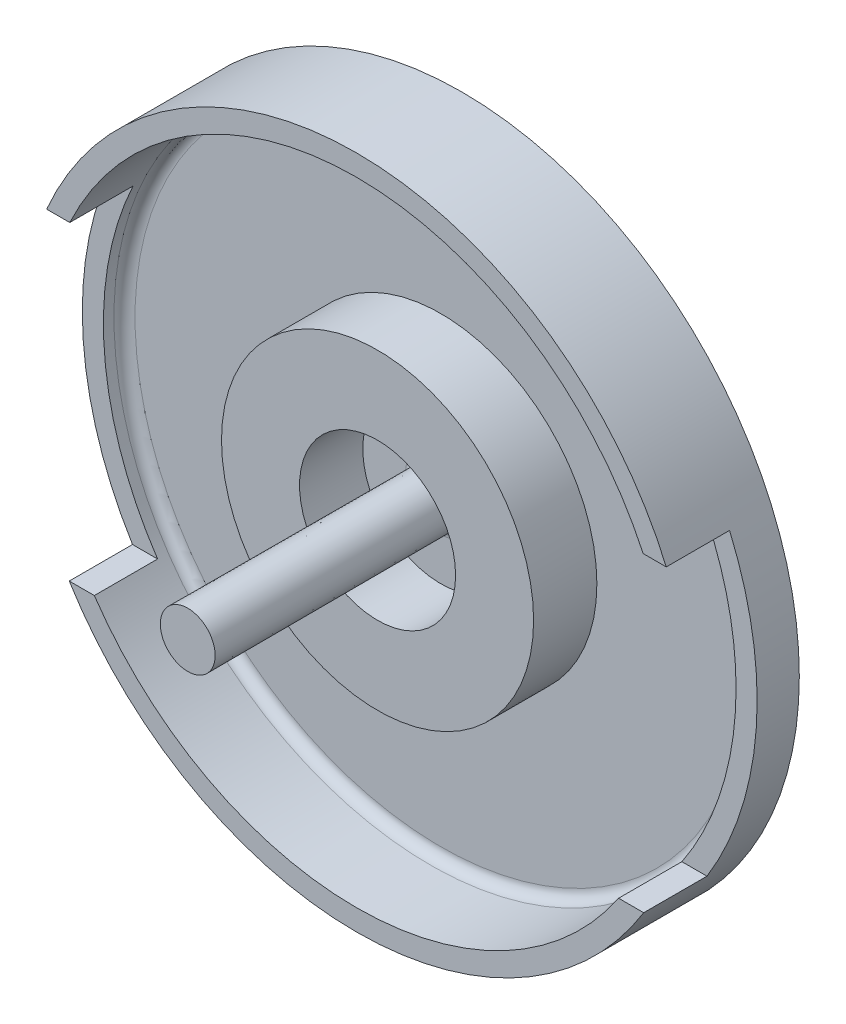
ISO-10303-21;
HEADER;
FILE_DESCRIPTION(('STEP AP214'),'2;1');
FILE_NAME('part.step','',(''),(''),'','','');
FILE_SCHEMA(('AUTOMOTIVE_DESIGN { 1 0 10303 214 1 1 1 1 }'));
ENDSEC;
DATA;
#1=APPLICATION_CONTEXT('core data for automotive mechanical design processes');
#2=APPLICATION_PROTOCOL_DEFINITION('international standard','automotive_design',2000,#1);
#3=PRODUCT_CONTEXT('',#1,'mechanical');
#4=PRODUCT('Part','Part','',(#3));
#5=PRODUCT_RELATED_PRODUCT_CATEGORY('part','',(#4));
#6=PRODUCT_DEFINITION_FORMATION('','',#4);
#7=PRODUCT_DEFINITION_CONTEXT('part definition',#1,'design');
#8=PRODUCT_DEFINITION('design','',#6,#7);
#9=PRODUCT_DEFINITION_SHAPE('','',#8);
#10=(LENGTH_UNIT() NAMED_UNIT(*) SI_UNIT(.MILLI.,.METRE.));
#11=(NAMED_UNIT(*) PLANE_ANGLE_UNIT() SI_UNIT($,.RADIAN.));
#12=(NAMED_UNIT(*) SI_UNIT($,.STERADIAN.) SOLID_ANGLE_UNIT());
#13=UNCERTAINTY_MEASURE_WITH_UNIT(LENGTH_MEASURE(1.E-05),#10,'distance_accuracy_value','');
#14=(GEOMETRIC_REPRESENTATION_CONTEXT(3) GLOBAL_UNCERTAINTY_ASSIGNED_CONTEXT((#13)) GLOBAL_UNIT_ASSIGNED_CONTEXT((#10,
#11,#12)) REPRESENTATION_CONTEXT('',''));
#15=CARTESIAN_POINT('',(0.,0.,0.));
#16=DIRECTION('',(0.,0.,1.));
#17=DIRECTION('',(1.,0.,0.));
#18=AXIS2_PLACEMENT_3D('',#15,#16,#17);
#19=CARTESIAN_POINT('',(0.,0.,1.));
#20=DIRECTION('',(0.,0.,1.));
#21=DIRECTION('',(1.,0.,0.));
#22=AXIS2_PLACEMENT_3D('',#19,#20,#21);
#23=PLANE('',#22);
#24=CARTESIAN_POINT('',(0.,0.,1.));
#25=DIRECTION('',(0.,0.,1.));
#26=DIRECTION('',(1.,0.,0.));
#27=AXIS2_PLACEMENT_3D('',#24,#25,#26);
#28=CIRCLE('',#27,1.67583420138795);
#29=CARTESIAN_POINT('',(1.67583420138795,0.,1.));
#30=VERTEX_POINT('',#29);
#31=EDGE_CURVE('E12',#30,#30,#28,.F.);
#32=ORIENTED_EDGE('',*,*,#31,.T.);
#33=EDGE_LOOP('',(#32));
#34=FACE_BOUND('',#33,.T.);
#35=CARTESIAN_POINT('',(0.,0.,1.));
#36=DIRECTION('',(0.,0.,1.));
#37=DIRECTION('',(1.,0.,0.));
#38=AXIS2_PLACEMENT_3D('',#35,#36,#37);
#39=CIRCLE('',#38,3.7);
#40=CARTESIAN_POINT('',(3.7,0.,1.));
#41=VERTEX_POINT('',#40);
#42=EDGE_CURVE('E393',#41,#41,#39,.T.);
#43=ORIENTED_EDGE('',*,*,#42,.T.);
#44=EDGE_LOOP('',(#43));
#45=FACE_BOUND('',#44,.T.);
#46=ADVANCED_FACE('F43',(#34,#45),#23,.T.);
#47=CARTESIAN_POINT('',(0.,0.,5.));
#48=DIRECTION('',(0.,0.,1.));
#49=DIRECTION('',(1.,0.,0.));
#50=AXIS2_PLACEMENT_3D('',#47,#48,#49);
#51=PLANE('',#50);
#52=CARTESIAN_POINT('',(0.,0.,5.));
#53=DIRECTION('',(0.,0.,1.));
#54=DIRECTION('',(1.,0.,0.));
#55=AXIS2_PLACEMENT_3D('',#52,#53,#54);
#56=CIRCLE('',#55,16.);
#57=CARTESIAN_POINT('',(-13.6201960323075,-8.39584778575195,5.));
#58=VERTEX_POINT('',#57);
#59=CARTESIAN_POINT('',(13.6201960323075,-8.39584778575195,5.));
#60=VERTEX_POINT('',#59);
#61=EDGE_CURVE('E160',#58,#60,#56,.T.);
#62=ORIENTED_EDGE('',*,*,#61,.T.);
#63=DIRECTION('',(-1.,0.,0.));
#64=VECTOR('',#63,1.);
#65=CARTESIAN_POINT('',(0.,-8.39584778575195,5.));
#66=LINE('',#65,#64);
#67=CARTESIAN_POINT('',(12.4301946870708,-8.39584778575195,5.));
#68=VERTEX_POINT('',#67);
#69=EDGE_CURVE('E112',#60,#68,#66,.T.);
#70=ORIENTED_EDGE('',*,*,#69,.T.);
#71=CARTESIAN_POINT('',(0.,0.,5.));
#72=DIRECTION('',(0.,0.,1.));
#73=DIRECTION('',(1.,0.,0.));
#74=AXIS2_PLACEMENT_3D('',#71,#72,#73);
#75=CIRCLE('',#74,15.);
#76=CARTESIAN_POINT('',(-12.4301946870708,-8.39584778575195,5.));
#77=VERTEX_POINT('',#76);
#78=EDGE_CURVE('E151',#77,#68,#75,.T.);
#79=ORIENTED_EDGE('',*,*,#78,.F.);
#80=DIRECTION('',(1.,0.,0.));
#81=VECTOR('',#80,1.);
#82=CARTESIAN_POINT('',(0.,-8.39584778575195,5.));
#83=LINE('',#82,#81);
#84=EDGE_CURVE('E145',#58,#77,#83,.T.);
#85=ORIENTED_EDGE('',*,*,#84,.F.);
#86=EDGE_LOOP('',(#62,#70,#79,#85));
#87=FACE_BOUND('',#86,.T.);
#88=ADVANCED_FACE('F198',(#87),#51,.T.);
#89=CARTESIAN_POINT('',(0.,0.,5.));
#90=DIRECTION('',(0.,0.,-1.));
#91=DIRECTION('',(-1.,0.,0.));
#92=AXIS2_PLACEMENT_3D('',#89,#90,#91);
#93=CYLINDRICAL_SURFACE('',#92,16.);
#94=CARTESIAN_POINT('',(0.,0.,0.));
#95=DIRECTION('',(0.,0.,1.));
#96=DIRECTION('',(1.,0.,0.));
#97=AXIS2_PLACEMENT_3D('',#94,#95,#96);
#98=CIRCLE('',#97,16.);
#99=CARTESIAN_POINT('',(16.,0.,0.));
#100=VERTEX_POINT('',#99);
#101=EDGE_CURVE('E156',#100,#100,#98,.T.);
#102=ORIENTED_EDGE('',*,*,#101,.T.);
#103=EDGE_LOOP('',(#102));
#104=FACE_BOUND('',#103,.T.);
#105=CARTESIAN_POINT('',(14.6905696553376,6.33933460243845,5.));
#106=VERTEX_POINT('',#105);
#107=CARTESIAN_POINT('',(-14.6905696553376,6.33933460243845,5.));
#108=VERTEX_POINT('',#107);
#109=EDGE_CURVE('E130',#106,#108,#56,.T.);
#110=ORIENTED_EDGE('',*,*,#109,.F.);
#111=DIRECTION('',(0.,0.,-1.));
#112=VECTOR('',#111,1.);
#113=CARTESIAN_POINT('',(14.6905696553376,6.33933460243845,5.));
#114=LINE('',#113,#112);
#115=CARTESIAN_POINT('',(14.6905696553376,6.33933460243845,2.));
#116=VERTEX_POINT('',#115);
#117=EDGE_CURVE('E117',#106,#116,#114,.T.);
#118=ORIENTED_EDGE('',*,*,#117,.T.);
#119=CARTESIAN_POINT('',(0.,0.,2.));
#120=DIRECTION('',(0.,0.,-1.));
#121=DIRECTION('',(-1.,0.,0.));
#122=AXIS2_PLACEMENT_3D('',#119,#120,#121);
#123=CIRCLE('',#122,16.);
#124=CARTESIAN_POINT('',(13.6201960323075,-8.39584778575195,2.));
#125=VERTEX_POINT('',#124);
#126=EDGE_CURVE('E110',#116,#125,#123,.T.);
#127=ORIENTED_EDGE('',*,*,#126,.T.);
#128=DIRECTION('',(0.,0.,-1.));
#129=VECTOR('',#128,1.);
#130=CARTESIAN_POINT('',(13.6201960323075,-8.39584778575195,5.));
#131=LINE('',#130,#129);
#132=EDGE_CURVE('E134',#60,#125,#131,.T.);
#133=ORIENTED_EDGE('',*,*,#132,.F.);
#134=ORIENTED_EDGE('',*,*,#61,.F.);
#135=DIRECTION('',(0.,0.,-1.));
#136=VECTOR('',#135,1.);
#137=CARTESIAN_POINT('',(-13.6201960323075,-8.39584778575195,5.));
#138=LINE('',#137,#136);
#139=CARTESIAN_POINT('',(-13.6201960323075,-8.39584778575195,2.));
#140=VERTEX_POINT('',#139);
#141=EDGE_CURVE('E144',#58,#140,#138,.T.);
#142=ORIENTED_EDGE('',*,*,#141,.T.);
#143=CARTESIAN_POINT('',(0.,0.,2.));
#144=DIRECTION('',(0.,0.,-1.));
#145=DIRECTION('',(-1.,0.,0.));
#146=AXIS2_PLACEMENT_3D('',#143,#144,#145);
#147=CIRCLE('',#146,16.);
#148=CARTESIAN_POINT('',(-14.6905696553376,6.33933460243845,2.));
#149=VERTEX_POINT('',#148);
#150=EDGE_CURVE('E138',#140,#149,#147,.T.);
#151=ORIENTED_EDGE('',*,*,#150,.T.);
#152=DIRECTION('',(0.,0.,-1.));
#153=VECTOR('',#152,1.);
#154=CARTESIAN_POINT('',(-14.6905696553376,6.33933460243845,5.));
#155=LINE('',#154,#153);
#156=EDGE_CURVE('E147',#108,#149,#155,.T.);
#157=ORIENTED_EDGE('',*,*,#156,.F.);
#158=EDGE_LOOP('',(#110,#118,#127,#133,#134,#142,#151,#157));
#159=FACE_BOUND('',#158,.T.);
#160=ADVANCED_FACE('F129',(#104,#159),#93,.T.);
#161=DIRECTION('',(-1.,0.,0.));
#162=VECTOR('',#161,1.);
#163=CARTESIAN_POINT('',(0.,6.33933460243845,5.));
#164=LINE('',#163,#162);
#165=CARTESIAN_POINT('',(13.5945885115485,6.33933460243845,5.));
#166=VERTEX_POINT('',#165);
#167=EDGE_CURVE('E127',#106,#166,#164,.T.);
#168=ORIENTED_EDGE('',*,*,#167,.F.);
#169=ORIENTED_EDGE('',*,*,#109,.T.);
#170=DIRECTION('',(1.,0.,0.));
#171=VECTOR('',#170,1.);
#172=CARTESIAN_POINT('',(0.,6.33933460243845,5.));
#173=LINE('',#172,#171);
#174=CARTESIAN_POINT('',(-13.5945885115485,6.33933460243845,5.));
#175=VERTEX_POINT('',#174);
#176=EDGE_CURVE('E146',#108,#175,#173,.T.);
#177=ORIENTED_EDGE('',*,*,#176,.T.);
#178=EDGE_CURVE('E155',#166,#175,#75,.T.);
#179=ORIENTED_EDGE('',*,*,#178,.F.);
#180=EDGE_LOOP('',(#168,#169,#177,#179));
#181=FACE_BOUND('',#180,.T.);
#182=ADVANCED_FACE('F204',(#181),#51,.T.);
#183=CARTESIAN_POINT('',(0.,0.,1.));
#184=DIRECTION('',(0.,0.,1.));
#185=DIRECTION('',(1.,0.,0.));
#186=AXIS2_PLACEMENT_3D('',#183,#184,#185);
#187=CYLINDRICAL_SURFACE('',#186,15.);
#188=CARTESIAN_POINT('',(0.,0.,2.));
#189=DIRECTION('',(0.,0.,-1.));
#190=DIRECTION('',(-1.,0.,0.));
#191=AXIS2_PLACEMENT_3D('',#188,#189,#190);
#192=CIRCLE('',#191,15.);
#193=CARTESIAN_POINT('',(12.4301946870708,-8.39584778575195,2.));
#194=VERTEX_POINT('',#193);
#195=CARTESIAN_POINT('',(13.5945885115485,6.33933460243845,2.));
#196=VERTEX_POINT('',#195);
#197=EDGE_CURVE('E180',#194,#196,#192,.F.);
#198=ORIENTED_EDGE('',*,*,#197,.T.);
#199=DIRECTION('',(0.,0.,1.));
#200=VECTOR('',#199,1.);
#201=CARTESIAN_POINT('',(13.5945885115485,6.33933460243845,1.));
#202=LINE('',#201,#200);
#203=EDGE_CURVE('E122',#196,#166,#202,.T.);
#204=ORIENTED_EDGE('',*,*,#203,.T.);
#205=ORIENTED_EDGE('',*,*,#178,.T.);
#206=DIRECTION('',(0.,0.,1.));
#207=VECTOR('',#206,1.);
#208=CARTESIAN_POINT('',(-13.5945885115485,6.33933460243845,1.));
#209=LINE('',#208,#207);
#210=CARTESIAN_POINT('',(-13.5945885115485,6.33933460243845,2.));
#211=VERTEX_POINT('',#210);
#212=EDGE_CURVE('E172',#211,#175,#209,.T.);
#213=ORIENTED_EDGE('',*,*,#212,.F.);
#214=CARTESIAN_POINT('',(0.,0.,2.));
#215=DIRECTION('',(0.,0.,-1.));
#216=DIRECTION('',(-1.,0.,0.));
#217=AXIS2_PLACEMENT_3D('',#214,#215,#216);
#218=CIRCLE('',#217,15.);
#219=CARTESIAN_POINT('',(-12.4301946870708,-8.39584778575195,2.));
#220=VERTEX_POINT('',#219);
#221=EDGE_CURVE('E166',#211,#220,#218,.F.);
#222=ORIENTED_EDGE('',*,*,#221,.T.);
#223=DIRECTION('',(0.,0.,1.));
#224=VECTOR('',#223,1.);
#225=CARTESIAN_POINT('',(-12.4301946870708,-8.39584778575195,1.));
#226=LINE('',#225,#224);
#227=EDGE_CURVE('E171',#220,#77,#226,.T.);
#228=ORIENTED_EDGE('',*,*,#227,.T.);
#229=ORIENTED_EDGE('',*,*,#78,.T.);
#230=DIRECTION('',(0.,0.,1.));
#231=VECTOR('',#230,1.);
#232=CARTESIAN_POINT('',(12.4301946870708,-8.39584778575195,1.));
#233=LINE('',#232,#231);
#234=EDGE_CURVE('E177',#194,#68,#233,.T.);
#235=ORIENTED_EDGE('',*,*,#234,.F.);
#236=EDGE_LOOP('',(#198,#204,#205,#213,#222,#228,#229,#235));
#237=FACE_BOUND('',#236,.T.);
#238=CARTESIAN_POINT('',(0.,0.,1.5));
#239=DIRECTION('',(0.,0.,1.));
#240=DIRECTION('',(1.,0.,0.));
#241=AXIS2_PLACEMENT_3D('',#238,#239,#240);
#242=CIRCLE('',#241,15.);
#243=CARTESIAN_POINT('',(15.,0.,1.5));
#244=VERTEX_POINT('',#243);
#245=EDGE_CURVE('E164',#244,#244,#242,.F.);
#246=ORIENTED_EDGE('',*,*,#245,.T.);
#247=EDGE_LOOP('',(#246));
#248=FACE_BOUND('',#247,.T.);
#249=ADVANCED_FACE('F250',(#237,#248),#187,.F.);
#250=CARTESIAN_POINT('',(0.,0.,0.));
#251=DIRECTION('',(0.,0.,1.));
#252=DIRECTION('',(1.,0.,0.));
#253=AXIS2_PLACEMENT_3D('',#250,#251,#252);
#254=PLANE('',#253);
#255=ORIENTED_EDGE('',*,*,#101,.F.);
#256=EDGE_LOOP('',(#255));
#257=FACE_BOUND('',#256,.T.);
#258=ADVANCED_FACE('F244',(#257),#254,.F.);
#259=CARTESIAN_POINT('',(0.,0.,1.));
#260=DIRECTION('',(0.,0.,1.));
#261=DIRECTION('',(1.,0.,0.));
#262=AXIS2_PLACEMENT_3D('',#259,#260,#261);
#263=PLANE('',#262);
#264=CARTESIAN_POINT('',(0.,0.,1.));
#265=DIRECTION('',(0.,0.,1.));
#266=DIRECTION('',(1.,0.,0.));
#267=AXIS2_PLACEMENT_3D('',#264,#265,#266);
#268=CIRCLE('',#267,7.4);
#269=CARTESIAN_POINT('',(7.4,0.,1.));
#270=VERTEX_POINT('',#269);
#271=EDGE_CURVE('E394',#270,#270,#268,.T.);
#272=ORIENTED_EDGE('',*,*,#271,.F.);
#273=EDGE_LOOP('',(#272));
#274=FACE_BOUND('',#273,.T.);
#275=CARTESIAN_POINT('',(0.,0.,1.));
#276=DIRECTION('',(0.,0.,1.));
#277=DIRECTION('',(1.,0.,0.));
#278=AXIS2_PLACEMENT_3D('',#275,#276,#277);
#279=CIRCLE('',#278,14.5);
#280=CARTESIAN_POINT('',(14.5,0.,1.));
#281=VERTEX_POINT('',#280);
#282=EDGE_CURVE('E159',#281,#281,#279,.T.);
#283=ORIENTED_EDGE('',*,*,#282,.T.);
#284=EDGE_LOOP('',(#283));
#285=FACE_BOUND('',#284,.T.);
#286=ADVANCED_FACE('F245',(#274,#285),#263,.T.);
#287=CARTESIAN_POINT('',(0.,0.,1.5));
#288=DIRECTION('',(0.,0.,1.));
#289=DIRECTION('',(1.,0.,0.));
#290=AXIS2_PLACEMENT_3D('',#287,#288,#289);
#291=TOROIDAL_SURFACE('',#290,14.5,0.5);
#292=ORIENTED_EDGE('',*,*,#245,.F.);
#293=EDGE_LOOP('',(#292));
#294=FACE_BOUND('',#293,.T.);
#295=ORIENTED_EDGE('',*,*,#282,.F.);
#296=EDGE_LOOP('',(#295));
#297=FACE_BOUND('',#296,.T.);
#298=ADVANCED_FACE('F239',(#294,#297),#291,.F.);
#299=CARTESIAN_POINT('',(-17.0905034214387,6.33933460243845,2.));
#300=DIRECTION('',(0.,-1.,0.));
#301=DIRECTION('',(0.,0.,-1.));
#302=AXIS2_PLACEMENT_3D('',#299,#300,#301);
#303=PLANE('',#302);
#304=ORIENTED_EDGE('',*,*,#156,.T.);
#305=DIRECTION('',(1.,0.,0.));
#306=VECTOR('',#305,1.);
#307=CARTESIAN_POINT('',(-17.0905034214387,6.33933460243845,2.));
#308=LINE('',#307,#306);
#309=EDGE_CURVE('E128',#149,#211,#308,.T.);
#310=ORIENTED_EDGE('',*,*,#309,.T.);
#311=ORIENTED_EDGE('',*,*,#212,.T.);
#312=ORIENTED_EDGE('',*,*,#176,.F.);
#313=EDGE_LOOP('',(#304,#310,#311,#312));
#314=FACE_BOUND('',#313,.T.);
#315=ADVANCED_FACE('F236',(#314),#303,.T.);
#316=CARTESIAN_POINT('',(-17.0905034214387,-8.39584778575195,2.));
#317=DIRECTION('',(0.,-1.,0.));
#318=DIRECTION('',(0.,0.,-1.));
#319=AXIS2_PLACEMENT_3D('',#316,#317,#318);
#320=PLANE('',#319);
#321=ORIENTED_EDGE('',*,*,#84,.T.);
#322=ORIENTED_EDGE('',*,*,#227,.F.);
#323=DIRECTION('',(1.,0.,0.));
#324=VECTOR('',#323,1.);
#325=CARTESIAN_POINT('',(-17.0905034214387,-8.39584778575195,2.));
#326=LINE('',#325,#324);
#327=EDGE_CURVE('E68',#140,#220,#326,.T.);
#328=ORIENTED_EDGE('',*,*,#327,.F.);
#329=ORIENTED_EDGE('',*,*,#141,.F.);
#330=EDGE_LOOP('',(#321,#322,#328,#329));
#331=FACE_BOUND('',#330,.T.);
#332=ADVANCED_FACE('F231',(#331),#320,.F.);
#333=CARTESIAN_POINT('',(0.,0.,2.));
#334=DIRECTION('',(0.,0.,-1.));
#335=DIRECTION('',(-1.,0.,0.));
#336=AXIS2_PLACEMENT_3D('',#333,#334,#335);
#337=PLANE('',#336);
#338=ORIENTED_EDGE('',*,*,#327,.T.);
#339=ORIENTED_EDGE('',*,*,#221,.F.);
#340=ORIENTED_EDGE('',*,*,#309,.F.);
#341=ORIENTED_EDGE('',*,*,#150,.F.);
#342=EDGE_LOOP('',(#338,#339,#340,#341));
#343=FACE_BOUND('',#342,.T.);
#344=ADVANCED_FACE('F229',(#343),#337,.F.);
#345=CARTESIAN_POINT('',(17.0905034214387,6.33933460243845,2.));
#346=DIRECTION('',(0.,1.,0.));
#347=DIRECTION('',(0.,0.,1.));
#348=AXIS2_PLACEMENT_3D('',#345,#346,#347);
#349=PLANE('',#348);
#350=ORIENTED_EDGE('',*,*,#167,.T.);
#351=ORIENTED_EDGE('',*,*,#203,.F.);
#352=DIRECTION('',(-1.,0.,0.));
#353=VECTOR('',#352,1.);
#354=CARTESIAN_POINT('',(17.0905034214387,6.33933460243845,2.));
#355=LINE('',#354,#353);
#356=EDGE_CURVE('E59',#116,#196,#355,.T.);
#357=ORIENTED_EDGE('',*,*,#356,.F.);
#358=ORIENTED_EDGE('',*,*,#117,.F.);
#359=EDGE_LOOP('',(#350,#351,#357,#358));
#360=FACE_BOUND('',#359,.T.);
#361=ADVANCED_FACE('F120',(#360),#349,.F.);
#362=CARTESIAN_POINT('',(17.0905034214387,-8.39584778575195,2.));
#363=DIRECTION('',(0.,1.,0.));
#364=DIRECTION('',(0.,0.,1.));
#365=AXIS2_PLACEMENT_3D('',#362,#363,#364);
#366=PLANE('',#365);
#367=ORIENTED_EDGE('',*,*,#132,.T.);
#368=DIRECTION('',(-1.,0.,0.));
#369=VECTOR('',#368,1.);
#370=CARTESIAN_POINT('',(17.0905034214387,-8.39584778575195,2.));
#371=LINE('',#370,#369);
#372=EDGE_CURVE('E109',#125,#194,#371,.T.);
#373=ORIENTED_EDGE('',*,*,#372,.T.);
#374=ORIENTED_EDGE('',*,*,#234,.T.);
#375=ORIENTED_EDGE('',*,*,#69,.F.);
#376=EDGE_LOOP('',(#367,#373,#374,#375));
#377=FACE_BOUND('',#376,.T.);
#378=ADVANCED_FACE('F223',(#377),#366,.T.);
#379=CARTESIAN_POINT('',(0.,0.,2.));
#380=DIRECTION('',(0.,0.,-1.));
#381=DIRECTION('',(1.,0.,0.));
#382=AXIS2_PLACEMENT_3D('',#379,#380,#381);
#383=PLANE('',#382);
#384=ORIENTED_EDGE('',*,*,#356,.T.);
#385=ORIENTED_EDGE('',*,*,#197,.F.);
#386=ORIENTED_EDGE('',*,*,#372,.F.);
#387=ORIENTED_EDGE('',*,*,#126,.F.);
#388=EDGE_LOOP('',(#384,#385,#386,#387));
#389=FACE_BOUND('',#388,.T.);
#390=ADVANCED_FACE('F108',(#389),#383,.F.);
#391=CARTESIAN_POINT('',(0.,0.,4.));
#392=DIRECTION('',(0.,0.,-1.));
#393=DIRECTION('',(-1.,0.,0.));
#394=AXIS2_PLACEMENT_3D('',#391,#392,#393);
#395=CYLINDRICAL_SURFACE('',#394,7.4);
#396=CARTESIAN_POINT('',(0.,0.,4.));
#397=DIRECTION('',(0.,0.,1.));
#398=DIRECTION('',(1.,0.,0.));
#399=AXIS2_PLACEMENT_3D('',#396,#397,#398);
#400=CIRCLE('',#399,7.4);
#401=CARTESIAN_POINT('',(7.4,0.,4.));
#402=VERTEX_POINT('',#401);
#403=EDGE_CURVE('E124',#402,#402,#400,.T.);
#404=ORIENTED_EDGE('',*,*,#403,.F.);
#405=EDGE_LOOP('',(#404));
#406=FACE_BOUND('',#405,.T.);
#407=ORIENTED_EDGE('',*,*,#271,.T.);
#408=EDGE_LOOP('',(#407));
#409=FACE_BOUND('',#408,.T.);
#410=ADVANCED_FACE('F220',(#406,#409),#395,.T.);
#411=CARTESIAN_POINT('',(0.,0.,4.));
#412=DIRECTION('',(0.,0.,1.));
#413=DIRECTION('',(1.,0.,0.));
#414=AXIS2_PLACEMENT_3D('',#411,#412,#413);
#415=PLANE('',#414);
#416=CARTESIAN_POINT('',(0.,0.,4.));
#417=DIRECTION('',(0.,0.,1.));
#418=DIRECTION('',(1.,0.,0.));
#419=AXIS2_PLACEMENT_3D('',#416,#417,#418);
#420=CIRCLE('',#419,3.7);
#421=CARTESIAN_POINT('',(3.7,0.,4.));
#422=VERTEX_POINT('',#421);
#423=EDGE_CURVE('E374',#422,#422,#420,.T.);
#424=ORIENTED_EDGE('',*,*,#423,.F.);
#425=EDGE_LOOP('',(#424));
#426=FACE_BOUND('',#425,.T.);
#427=ORIENTED_EDGE('',*,*,#403,.T.);
#428=EDGE_LOOP('',(#427));
#429=FACE_BOUND('',#428,.T.);
#430=ADVANCED_FACE('F215',(#426,#429),#415,.T.);
#431=CARTESIAN_POINT('',(0.,0.,1.));
#432=DIRECTION('',(0.,0.,1.));
#433=DIRECTION('',(1.,0.,0.));
#434=AXIS2_PLACEMENT_3D('',#431,#432,#433);
#435=CYLINDRICAL_SURFACE('',#434,3.7);
#436=ORIENTED_EDGE('',*,*,#42,.F.);
#437=EDGE_LOOP('',(#436));
#438=FACE_BOUND('',#437,.T.);
#439=ORIENTED_EDGE('',*,*,#423,.T.);
#440=EDGE_LOOP('',(#439));
#441=FACE_BOUND('',#440,.T.);
#442=ADVANCED_FACE('F208',(#438,#441),#435,.F.);
#443=CARTESIAN_POINT('',(0.,0.,13.));
#444=DIRECTION('',(0.,0.,1.));
#445=DIRECTION('',(1.,0.,0.));
#446=AXIS2_PLACEMENT_3D('',#443,#444,#445);
#447=PLANE('',#446);
#448=CARTESIAN_POINT('',(0.,0.,13.));
#449=DIRECTION('',(0.,0.,1.));
#450=DIRECTION('',(1.,0.,0.));
#451=AXIS2_PLACEMENT_3D('',#448,#449,#450);
#452=CIRCLE('',#451,1.3);
#453=CARTESIAN_POINT('',(1.3,0.,13.));
#454=VERTEX_POINT('',#453);
#455=EDGE_CURVE('E375',#454,#454,#452,.T.);
#456=ORIENTED_EDGE('',*,*,#455,.T.);
#457=EDGE_LOOP('',(#456));
#458=FACE_BOUND('',#457,.T.);
#459=ADVANCED_FACE('F191',(#458),#447,.T.);
#460=CARTESIAN_POINT('',(0.,0.,1.));
#461=DIRECTION('',(0.,0.,1.));
#462=DIRECTION('',(1.,0.,0.));
#463=AXIS2_PLACEMENT_3D('',#460,#461,#462);
#464=CONICAL_SURFACE('',#463,1.275,0.0020833303192594);
#465=CARTESIAN_POINT('',(0.,0.,1.40083333152489));
#466=DIRECTION('',(0.,0.,1.));
#467=DIRECTION('',(1.,0.,0.));
#468=AXIS2_PLACEMENT_3D('',#465,#466,#467);
#469=CIRCLE('',#468,1.27583506944068);
#470=CARTESIAN_POINT('',(1.27583506944068,0.,1.40083333152489));
#471=VERTEX_POINT('',#470);
#472=EDGE_CURVE('E51',#471,#471,#469,.T.);
#473=ORIENTED_EDGE('',*,*,#472,.T.);
#474=EDGE_LOOP('',(#473));
#475=FACE_BOUND('',#474,.T.);
#476=ORIENTED_EDGE('',*,*,#455,.F.);
#477=EDGE_LOOP('',(#476));
#478=FACE_BOUND('',#477,.T.);
#479=ADVANCED_FACE('F183',(#475,#478),#464,.T.);
#480=CARTESIAN_POINT('',(0.,0.,1.4));
#481=DIRECTION('',(0.,0.,1.));
#482=DIRECTION('',(1.,0.,0.));
#483=AXIS2_PLACEMENT_3D('',#480,#481,#482);
#484=TOROIDAL_SURFACE('',#483,1.67583420138795,0.4);
#485=ORIENTED_EDGE('',*,*,#31,.F.);
#486=EDGE_LOOP('',(#485));
#487=FACE_BOUND('',#486,.T.);
#488=ORIENTED_EDGE('',*,*,#472,.F.);
#489=EDGE_LOOP('',(#488));
#490=FACE_BOUND('',#489,.T.);
#491=ADVANCED_FACE('F44',(#487,#490),#484,.F.);
#492=CLOSED_SHELL('',(#46,#88,#160,#182,#249,#258,#286,#298,#315,#332,#344,#361,#378,#390,#410,
#430,#442,#459,#479,#491));
#493=MANIFOLD_SOLID_BREP('B2',#492);
#494=ADVANCED_BREP_SHAPE_REPRESENTATION('',(#18,#493),#14);
#495=SHAPE_DEFINITION_REPRESENTATION(#9,#494);
ENDSEC;
END-ISO-10303-21;
